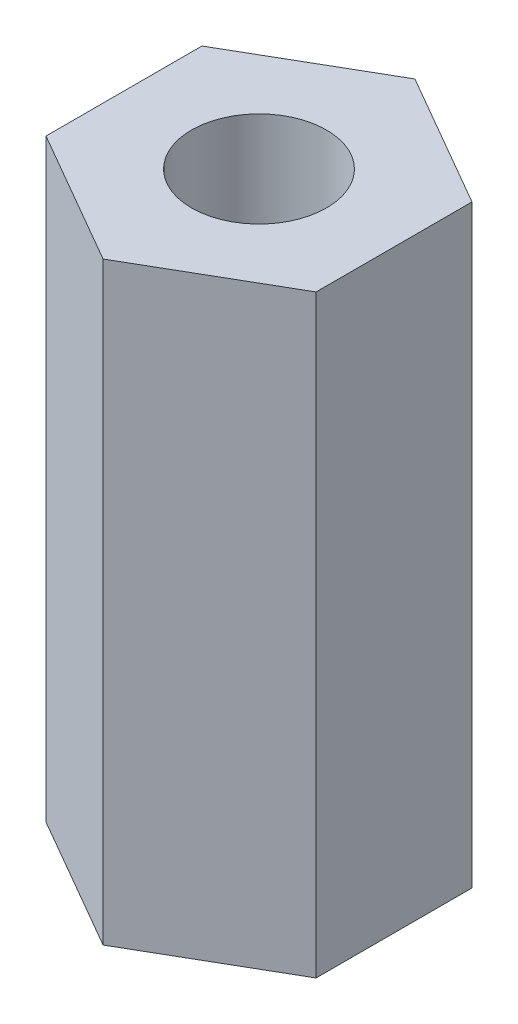
ISO-10303-21;
HEADER;
FILE_DESCRIPTION(('STEP AP214'),'2;1');
FILE_NAME('part.step','',(''),(''),'','','');
FILE_SCHEMA(('AUTOMOTIVE_DESIGN { 1 0 10303 214 1 1 1 1 }'));
ENDSEC;
DATA;
#1=APPLICATION_CONTEXT('core data for automotive mechanical design processes');
#2=APPLICATION_PROTOCOL_DEFINITION('international standard','automotive_design',2000,#1);
#3=PRODUCT_CONTEXT('',#1,'mechanical');
#4=PRODUCT('Part','Part','',(#3));
#5=PRODUCT_RELATED_PRODUCT_CATEGORY('part','',(#4));
#6=PRODUCT_DEFINITION_FORMATION('','',#4);
#7=PRODUCT_DEFINITION_CONTEXT('part definition',#1,'design');
#8=PRODUCT_DEFINITION('design','',#6,#7);
#9=PRODUCT_DEFINITION_SHAPE('','',#8);
#10=(LENGTH_UNIT() NAMED_UNIT(*) SI_UNIT(.MILLI.,.METRE.));
#11=(NAMED_UNIT(*) PLANE_ANGLE_UNIT() SI_UNIT($,.RADIAN.));
#12=(NAMED_UNIT(*) SI_UNIT($,.STERADIAN.) SOLID_ANGLE_UNIT());
#13=UNCERTAINTY_MEASURE_WITH_UNIT(LENGTH_MEASURE(1.E-05),#10,'distance_accuracy_value','');
#14=(GEOMETRIC_REPRESENTATION_CONTEXT(3) GLOBAL_UNCERTAINTY_ASSIGNED_CONTEXT((#13)) GLOBAL_UNIT_ASSIGNED_CONTEXT((#10,
#11,#12)) REPRESENTATION_CONTEXT('',''));
#15=CARTESIAN_POINT('',(0.,0.,0.));
#16=DIRECTION('',(0.,0.,1.));
#17=DIRECTION('',(1.,0.,0.));
#18=AXIS2_PLACEMENT_3D('',#15,#16,#17);
#19=CARTESIAN_POINT('',(0.,11.,0.));
#20=DIRECTION('',(0.,1.,0.));
#21=DIRECTION('',(0.,0.,1.));
#22=AXIS2_PLACEMENT_3D('',#19,#20,#21);
#23=PLANE('',#22);
#24=DIRECTION('',(-0.866025403784441,0.,-0.499999999999995));
#25=VECTOR('',#24,1.);
#26=CARTESIAN_POINT('',(2.49999999999998,11.,-1.44337567297409));
#27=LINE('',#26,#25);
#28=CARTESIAN_POINT('',(2.49999999999998,11.,-1.44337567297409));
#29=VERTEX_POINT('',#28);
#30=CARTESIAN_POINT('',(0.,11.,-2.88675134594813));
#31=VERTEX_POINT('',#30);
#32=EDGE_CURVE('E133',#29,#31,#27,.T.);
#33=ORIENTED_EDGE('',*,*,#32,.T.);
#34=DIRECTION('',(-0.866025403784438,0.,0.500000000000001));
#35=VECTOR('',#34,1.);
#36=CARTESIAN_POINT('',(0.,11.,-2.88675134594813));
#37=LINE('',#36,#35);
#38=CARTESIAN_POINT('',(-2.5,11.,-1.44337567297406));
#39=VERTEX_POINT('',#38);
#40=EDGE_CURVE('E91',#31,#39,#37,.T.);
#41=ORIENTED_EDGE('',*,*,#40,.T.);
#42=DIRECTION('',(0.,0.,1.));
#43=VECTOR('',#42,1.);
#44=CARTESIAN_POINT('',(-2.5,11.,-1.44337567297406));
#45=LINE('',#44,#43);
#46=CARTESIAN_POINT('',(-2.5,11.,1.44337567297408));
#47=VERTEX_POINT('',#46);
#48=EDGE_CURVE('E104',#39,#47,#45,.T.);
#49=ORIENTED_EDGE('',*,*,#48,.T.);
#50=DIRECTION('',(0.866025403784442,0.,0.499999999999995));
#51=VECTOR('',#50,1.);
#52=CARTESIAN_POINT('',(-2.5,11.,1.44337567297408));
#53=LINE('',#52,#51);
#54=CARTESIAN_POINT('',(0.,11.,2.88675134594813));
#55=VERTEX_POINT('',#54);
#56=EDGE_CURVE('E98',#47,#55,#53,.T.);
#57=ORIENTED_EDGE('',*,*,#56,.T.);
#58=DIRECTION('',(0.866025403784435,0.,-0.500000000000007));
#59=VECTOR('',#58,1.);
#60=CARTESIAN_POINT('',(0.,11.,2.88675134594813));
#61=LINE('',#60,#59);
#62=CARTESIAN_POINT('',(2.50000000000001,11.,1.44337567297404));
#63=VERTEX_POINT('',#62);
#64=EDGE_CURVE('E102',#55,#63,#61,.T.);
#65=ORIENTED_EDGE('',*,*,#64,.T.);
#66=DIRECTION('',(0.,0.,-1.));
#67=VECTOR('',#66,1.);
#68=CARTESIAN_POINT('',(2.50000000000001,11.,1.44337567297404));
#69=LINE('',#68,#67);
#70=EDGE_CURVE('E54',#63,#29,#69,.T.);
#71=ORIENTED_EDGE('',*,*,#70,.T.);
#72=EDGE_LOOP('',(#33,#41,#49,#57,#65,#71));
#73=FACE_BOUND('',#72,.T.);
#74=CARTESIAN_POINT('',(0.,11.,0.));
#75=DIRECTION('',(0.,1.,0.));
#76=DIRECTION('',(0.,0.,1.));
#77=AXIS2_PLACEMENT_3D('',#74,#75,#76);
#78=CIRCLE('',#77,1.25);
#79=CARTESIAN_POINT('',(0.,11.,1.25));
#80=VERTEX_POINT('',#79);
#81=EDGE_CURVE('E126',#80,#80,#78,.T.);
#82=ORIENTED_EDGE('',*,*,#81,.F.);
#83=EDGE_LOOP('',(#82));
#84=FACE_BOUND('',#83,.T.);
#85=ADVANCED_FACE('F37',(#73,#84),#23,.T.);
#86=CARTESIAN_POINT('',(0.,0.,0.));
#87=DIRECTION('',(0.,1.,0.));
#88=DIRECTION('',(0.,0.,1.));
#89=AXIS2_PLACEMENT_3D('',#86,#87,#88);
#90=PLANE('',#89);
#91=DIRECTION('',(-0.866025403784441,0.,-0.499999999999995));
#92=VECTOR('',#91,1.);
#93=CARTESIAN_POINT('',(2.49999999999998,0.,-1.44337567297409));
#94=LINE('',#93,#92);
#95=CARTESIAN_POINT('',(2.49999999999998,0.,-1.44337567297409));
#96=VERTEX_POINT('',#95);
#97=CARTESIAN_POINT('',(0.,0.,-2.88675134594813));
#98=VERTEX_POINT('',#97);
#99=EDGE_CURVE('E122',#96,#98,#94,.T.);
#100=ORIENTED_EDGE('',*,*,#99,.F.);
#101=DIRECTION('',(0.,0.,-1.));
#102=VECTOR('',#101,1.);
#103=CARTESIAN_POINT('',(2.50000000000001,0.,1.44337567297404));
#104=LINE('',#103,#102);
#105=CARTESIAN_POINT('',(2.50000000000001,0.,1.44337567297404));
#106=VERTEX_POINT('',#105);
#107=EDGE_CURVE('E83',#106,#96,#104,.T.);
#108=ORIENTED_EDGE('',*,*,#107,.F.);
#109=DIRECTION('',(0.866025403784435,0.,-0.500000000000007));
#110=VECTOR('',#109,1.);
#111=CARTESIAN_POINT('',(0.,0.,2.88675134594813));
#112=LINE('',#111,#110);
#113=CARTESIAN_POINT('',(0.,0.,2.88675134594813));
#114=VERTEX_POINT('',#113);
#115=EDGE_CURVE('E77',#114,#106,#112,.T.);
#116=ORIENTED_EDGE('',*,*,#115,.F.);
#117=DIRECTION('',(0.866025403784442,0.,0.499999999999995));
#118=VECTOR('',#117,1.);
#119=CARTESIAN_POINT('',(-2.5,0.,1.44337567297408));
#120=LINE('',#119,#118);
#121=CARTESIAN_POINT('',(-2.5,0.,1.44337567297408));
#122=VERTEX_POINT('',#121);
#123=EDGE_CURVE('E112',#122,#114,#120,.T.);
#124=ORIENTED_EDGE('',*,*,#123,.F.);
#125=DIRECTION('',(0.,0.,1.));
#126=VECTOR('',#125,1.);
#127=CARTESIAN_POINT('',(-2.5,0.,-1.44337567297406));
#128=LINE('',#127,#126);
#129=CARTESIAN_POINT('',(-2.5,0.,-1.44337567297406));
#130=VERTEX_POINT('',#129);
#131=EDGE_CURVE('E128',#130,#122,#128,.T.);
#132=ORIENTED_EDGE('',*,*,#131,.F.);
#133=DIRECTION('',(-0.866025403784438,0.,0.500000000000001));
#134=VECTOR('',#133,1.);
#135=CARTESIAN_POINT('',(0.,0.,-2.88675134594813));
#136=LINE('',#135,#134);
#137=EDGE_CURVE('E125',#98,#130,#136,.T.);
#138=ORIENTED_EDGE('',*,*,#137,.F.);
#139=EDGE_LOOP('',(#100,#108,#116,#124,#132,#138));
#140=FACE_BOUND('',#139,.T.);
#141=CARTESIAN_POINT('',(0.,0.,0.));
#142=DIRECTION('',(0.,1.,0.));
#143=DIRECTION('',(0.,0.,1.));
#144=AXIS2_PLACEMENT_3D('',#141,#142,#143);
#145=CIRCLE('',#144,1.25);
#146=CARTESIAN_POINT('',(0.,0.,1.25));
#147=VERTEX_POINT('',#146);
#148=EDGE_CURVE('E244',#147,#147,#145,.T.);
#149=ORIENTED_EDGE('',*,*,#148,.T.);
#150=EDGE_LOOP('',(#149));
#151=FACE_BOUND('',#150,.T.);
#152=ADVANCED_FACE('F142',(#140,#151),#90,.F.);
#153=CARTESIAN_POINT('',(2.49999999999998,11.,-1.44337567297409));
#154=DIRECTION('',(-0.499999999999995,0.,0.866025403784441));
#155=DIRECTION('',(0.866025403784441,0.,0.499999999999995));
#156=AXIS2_PLACEMENT_3D('',#153,#154,#155);
#157=PLANE('',#156);
#158=ORIENTED_EDGE('',*,*,#99,.T.);
#159=DIRECTION('',(0.,-1.,0.));
#160=VECTOR('',#159,1.);
#161=CARTESIAN_POINT('',(0.,11.,-2.88675134594813));
#162=LINE('',#161,#160);
#163=EDGE_CURVE('E11',#31,#98,#162,.T.);
#164=ORIENTED_EDGE('',*,*,#163,.F.);
#165=ORIENTED_EDGE('',*,*,#32,.F.);
#166=DIRECTION('',(0.,-1.,0.));
#167=VECTOR('',#166,1.);
#168=CARTESIAN_POINT('',(2.49999999999998,11.,-1.44337567297409));
#169=LINE('',#168,#167);
#170=EDGE_CURVE('E118',#29,#96,#169,.T.);
#171=ORIENTED_EDGE('',*,*,#170,.T.);
#172=EDGE_LOOP('',(#158,#164,#165,#171));
#173=FACE_BOUND('',#172,.T.);
#174=ADVANCED_FACE('F39',(#173),#157,.F.);
#175=CARTESIAN_POINT('',(0.,11.,-2.88675134594813));
#176=DIRECTION('',(0.500000000000001,0.,0.866025403784438));
#177=DIRECTION('',(0.866025403784438,0.,-0.500000000000001));
#178=AXIS2_PLACEMENT_3D('',#175,#176,#177);
#179=PLANE('',#178);
#180=ORIENTED_EDGE('',*,*,#137,.T.);
#181=DIRECTION('',(0.,-1.,0.));
#182=VECTOR('',#181,1.);
#183=CARTESIAN_POINT('',(-2.5,11.,-1.44337567297406));
#184=LINE('',#183,#182);
#185=EDGE_CURVE('E46',#39,#130,#184,.T.);
#186=ORIENTED_EDGE('',*,*,#185,.F.);
#187=ORIENTED_EDGE('',*,*,#40,.F.);
#188=ORIENTED_EDGE('',*,*,#163,.T.);
#189=EDGE_LOOP('',(#180,#186,#187,#188));
#190=FACE_BOUND('',#189,.T.);
#191=ADVANCED_FACE('F167',(#190),#179,.F.);
#192=CARTESIAN_POINT('',(-2.5,11.,-1.44337567297406));
#193=DIRECTION('',(1.,0.,0.));
#194=DIRECTION('',(0.,0.,-1.));
#195=AXIS2_PLACEMENT_3D('',#192,#193,#194);
#196=PLANE('',#195);
#197=ORIENTED_EDGE('',*,*,#131,.T.);
#198=DIRECTION('',(0.,-1.,0.));
#199=VECTOR('',#198,1.);
#200=CARTESIAN_POINT('',(-2.5,11.,1.44337567297408));
#201=LINE('',#200,#199);
#202=EDGE_CURVE('E113',#47,#122,#201,.T.);
#203=ORIENTED_EDGE('',*,*,#202,.F.);
#204=ORIENTED_EDGE('',*,*,#48,.F.);
#205=ORIENTED_EDGE('',*,*,#185,.T.);
#206=EDGE_LOOP('',(#197,#203,#204,#205));
#207=FACE_BOUND('',#206,.T.);
#208=ADVANCED_FACE('F139',(#207),#196,.F.);
#209=CARTESIAN_POINT('',(-2.5,11.,1.44337567297408));
#210=DIRECTION('',(0.499999999999995,0.,-0.866025403784442));
#211=DIRECTION('',(-0.866025403784441,0.,-0.499999999999995));
#212=AXIS2_PLACEMENT_3D('',#209,#210,#211);
#213=PLANE('',#212);
#214=ORIENTED_EDGE('',*,*,#123,.T.);
#215=DIRECTION('',(0.,-1.,0.));
#216=VECTOR('',#215,1.);
#217=CARTESIAN_POINT('',(0.,11.,2.88675134594813));
#218=LINE('',#217,#216);
#219=EDGE_CURVE('E109',#55,#114,#218,.T.);
#220=ORIENTED_EDGE('',*,*,#219,.F.);
#221=ORIENTED_EDGE('',*,*,#56,.F.);
#222=ORIENTED_EDGE('',*,*,#202,.T.);
#223=EDGE_LOOP('',(#214,#220,#221,#222));
#224=FACE_BOUND('',#223,.T.);
#225=ADVANCED_FACE('F110',(#224),#213,.F.);
#226=CARTESIAN_POINT('',(0.,11.,2.88675134594813));
#227=DIRECTION('',(-0.500000000000007,0.,-0.866025403784435));
#228=DIRECTION('',(-0.866025403784435,0.,0.500000000000007));
#229=AXIS2_PLACEMENT_3D('',#226,#227,#228);
#230=PLANE('',#229);
#231=ORIENTED_EDGE('',*,*,#115,.T.);
#232=DIRECTION('',(0.,-1.,0.));
#233=VECTOR('',#232,1.);
#234=CARTESIAN_POINT('',(2.50000000000001,11.,1.44337567297404));
#235=LINE('',#234,#233);
#236=EDGE_CURVE('E114',#63,#106,#235,.T.);
#237=ORIENTED_EDGE('',*,*,#236,.F.);
#238=ORIENTED_EDGE('',*,*,#64,.F.);
#239=ORIENTED_EDGE('',*,*,#219,.T.);
#240=EDGE_LOOP('',(#231,#237,#238,#239));
#241=FACE_BOUND('',#240,.T.);
#242=ADVANCED_FACE('F116',(#241),#230,.F.);
#243=CARTESIAN_POINT('',(2.50000000000001,11.,1.44337567297404));
#244=DIRECTION('',(-1.,0.,0.));
#245=DIRECTION('',(0.,0.,1.));
#246=AXIS2_PLACEMENT_3D('',#243,#244,#245);
#247=PLANE('',#246);
#248=ORIENTED_EDGE('',*,*,#107,.T.);
#249=ORIENTED_EDGE('',*,*,#170,.F.);
#250=ORIENTED_EDGE('',*,*,#70,.F.);
#251=ORIENTED_EDGE('',*,*,#236,.T.);
#252=EDGE_LOOP('',(#248,#249,#250,#251));
#253=FACE_BOUND('',#252,.T.);
#254=ADVANCED_FACE('F147',(#253),#247,.F.);
#255=CARTESIAN_POINT('',(0.,11.,0.));
#256=DIRECTION('',(0.,-1.,0.));
#257=DIRECTION('',(0.,0.,-1.));
#258=AXIS2_PLACEMENT_3D('',#255,#256,#257);
#259=CYLINDRICAL_SURFACE('',#258,1.25);
#260=ORIENTED_EDGE('',*,*,#81,.T.);
#261=EDGE_LOOP('',(#260));
#262=FACE_BOUND('',#261,.T.);
#263=ORIENTED_EDGE('',*,*,#148,.F.);
#264=EDGE_LOOP('',(#263));
#265=FACE_BOUND('',#264,.T.);
#266=ADVANCED_FACE('F149',(#262,#265),#259,.F.);
#267=CLOSED_SHELL('',(#85,#152,#174,#191,#208,#225,#242,#254,#266));
#268=MANIFOLD_SOLID_BREP('B2',#267);
#269=ADVANCED_BREP_SHAPE_REPRESENTATION('',(#18,#268),#14);
#270=SHAPE_DEFINITION_REPRESENTATION(#9,#269);
ENDSEC;
END-ISO-10303-21;
